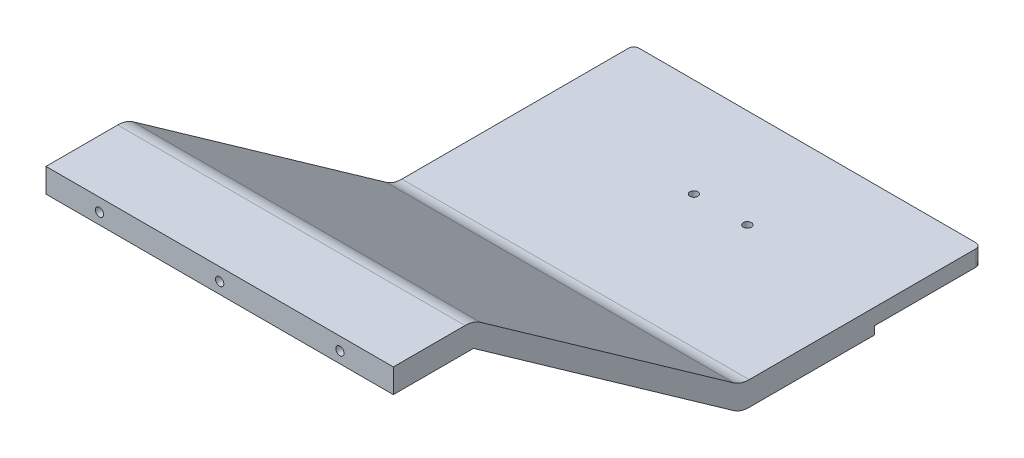
ISO-10303-21;
HEADER;
FILE_DESCRIPTION(('STEP AP214'),'2;1');
FILE_NAME('part.step','',(''),(''),'','','');
FILE_SCHEMA(('AUTOMOTIVE_DESIGN { 1 0 10303 214 1 1 1 1 }'));
ENDSEC;
DATA;
#1=APPLICATION_CONTEXT('core data for automotive mechanical design processes');
#2=APPLICATION_PROTOCOL_DEFINITION('international standard','automotive_design',2000,#1);
#3=PRODUCT_CONTEXT('',#1,'mechanical');
#4=PRODUCT('Part','Part','',(#3));
#5=PRODUCT_RELATED_PRODUCT_CATEGORY('part','',(#4));
#6=PRODUCT_DEFINITION_FORMATION('','',#4);
#7=PRODUCT_DEFINITION_CONTEXT('part definition',#1,'design');
#8=PRODUCT_DEFINITION('design','',#6,#7);
#9=PRODUCT_DEFINITION_SHAPE('','',#8);
#10=(LENGTH_UNIT() NAMED_UNIT(*) SI_UNIT(.MILLI.,.METRE.));
#11=(NAMED_UNIT(*) PLANE_ANGLE_UNIT() SI_UNIT($,.RADIAN.));
#12=(NAMED_UNIT(*) SI_UNIT($,.STERADIAN.) SOLID_ANGLE_UNIT());
#13=UNCERTAINTY_MEASURE_WITH_UNIT(LENGTH_MEASURE(1.E-05),#10,'distance_accuracy_value','');
#14=(GEOMETRIC_REPRESENTATION_CONTEXT(3) GLOBAL_UNCERTAINTY_ASSIGNED_CONTEXT((#13)) GLOBAL_UNIT_ASSIGNED_CONTEXT((#10,
#11,#12)) REPRESENTATION_CONTEXT('',''));
#15=CARTESIAN_POINT('',(0.,0.,0.));
#16=DIRECTION('',(0.,0.,1.));
#17=DIRECTION('',(1.,0.,0.));
#18=AXIS2_PLACEMENT_3D('',#15,#16,#17);
#19=CARTESIAN_POINT('',(209.,70.,-50.));
#20=DIRECTION('',(0.,0.,1.));
#21=DIRECTION('',(1.,0.,0.));
#22=AXIS2_PLACEMENT_3D('',#19,#20,#21);
#23=PLANE('',#22);
#24=DIRECTION('',(0.,1.,0.));
#25=VECTOR('',#24,1.);
#26=CARTESIAN_POINT('',(79.,70.,-50.));
#27=LINE('',#26,#25);
#28=CARTESIAN_POINT('',(79.,70.,-50.));
#29=VERTEX_POINT('',#28);
#30=CARTESIAN_POINT('',(79.,73.,-50.));
#31=VERTEX_POINT('',#30);
#32=EDGE_CURVE('E190',#29,#31,#27,.T.);
#33=ORIENTED_EDGE('',*,*,#32,.T.);
#34=DIRECTION('',(-1.,0.,0.));
#35=VECTOR('',#34,1.);
#36=CARTESIAN_POINT('',(209.,73.,-50.));
#37=LINE('',#36,#35);
#38=CARTESIAN_POINT('',(209.,73.,-50.));
#39=VERTEX_POINT('',#38);
#40=EDGE_CURVE('E252',#39,#31,#37,.T.);
#41=ORIENTED_EDGE('',*,*,#40,.F.);
#42=DIRECTION('',(0.,1.,0.));
#43=VECTOR('',#42,1.);
#44=CARTESIAN_POINT('',(209.,70.,-50.));
#45=LINE('',#44,#43);
#46=CARTESIAN_POINT('',(209.,70.,-50.));
#47=VERTEX_POINT('',#46);
#48=EDGE_CURVE('E197',#47,#39,#45,.T.);
#49=ORIENTED_EDGE('',*,*,#48,.F.);
#50=DIRECTION('',(-1.,0.,0.));
#51=VECTOR('',#50,1.);
#52=CARTESIAN_POINT('',(209.,70.,-50.));
#53=LINE('',#52,#51);
#54=EDGE_CURVE('E214',#47,#29,#53,.T.);
#55=ORIENTED_EDGE('',*,*,#54,.T.);
#56=EDGE_LOOP('',(#33,#41,#49,#55));
#57=FACE_BOUND('',#56,.T.);
#58=ADVANCED_FACE('F57',(#57),#23,.F.);
#59=CARTESIAN_POINT('',(209.,73.,-50.));
#60=DIRECTION('',(0.,1.,0.));
#61=DIRECTION('',(0.,0.,1.));
#62=AXIS2_PLACEMENT_3D('',#59,#60,#61);
#63=PLANE('',#62);
#64=CARTESIAN_POINT('',(138.5,73.,-53.));
#65=DIRECTION('',(0.,-1.,0.));
#66=DIRECTION('',(0.,0.,-1.));
#67=AXIS2_PLACEMENT_3D('',#64,#65,#66);
#68=CIRCLE('',#67,1.5);
#69=CARTESIAN_POINT('',(138.5,73.,-54.5));
#70=VERTEX_POINT('',#69);
#71=EDGE_CURVE('E277',#70,#70,#68,.T.);
#72=ORIENTED_EDGE('',*,*,#71,.F.);
#73=EDGE_LOOP('',(#72));
#74=FACE_BOUND('',#73,.T.);
#75=CARTESIAN_POINT('',(158.5,73.,-53.));
#76=DIRECTION('',(0.,-1.,0.));
#77=DIRECTION('',(0.,0.,-1.));
#78=AXIS2_PLACEMENT_3D('',#75,#76,#77);
#79=CIRCLE('',#78,1.5);
#80=CARTESIAN_POINT('',(158.5,73.,-54.5));
#81=VERTEX_POINT('',#80);
#82=EDGE_CURVE('E557',#81,#81,#79,.T.);
#83=ORIENTED_EDGE('',*,*,#82,.F.);
#84=EDGE_LOOP('',(#83));
#85=FACE_BOUND('',#84,.T.);
#86=DIRECTION('',(-1.,0.,0.));
#87=VECTOR('',#86,1.);
#88=CARTESIAN_POINT('',(209.,73.,-90.));
#89=LINE('',#88,#87);
#90=CARTESIAN_POINT('',(207.,73.,-90.));
#91=VERTEX_POINT('',#90);
#92=CARTESIAN_POINT('',(81.,73.,-90.));
#93=VERTEX_POINT('',#92);
#94=EDGE_CURVE('E247',#91,#93,#89,.T.);
#95=ORIENTED_EDGE('',*,*,#94,.F.);
#96=CARTESIAN_POINT('',(207.,73.,-88.));
#97=DIRECTION('',(0.,1.,0.));
#98=DIRECTION('',(0.,0.,1.));
#99=AXIS2_PLACEMENT_3D('',#96,#97,#98);
#100=CIRCLE('',#99,2.);
#101=CARTESIAN_POINT('',(209.,73.,-88.));
#102=VERTEX_POINT('',#101);
#103=EDGE_CURVE('E267',#91,#102,#100,.F.);
#104=ORIENTED_EDGE('',*,*,#103,.T.);
#105=DIRECTION('',(0.,0.,-1.));
#106=VECTOR('',#105,1.);
#107=CARTESIAN_POINT('',(209.,73.,-50.));
#108=LINE('',#107,#106);
#109=EDGE_CURVE('E196',#39,#102,#108,.T.);
#110=ORIENTED_EDGE('',*,*,#109,.F.);
#111=ORIENTED_EDGE('',*,*,#40,.T.);
#112=DIRECTION('',(0.,0.,-1.));
#113=VECTOR('',#112,1.);
#114=CARTESIAN_POINT('',(79.,73.,-50.));
#115=LINE('',#114,#113);
#116=CARTESIAN_POINT('',(79.,73.,-88.));
#117=VERTEX_POINT('',#116);
#118=EDGE_CURVE('E188',#31,#117,#115,.T.);
#119=ORIENTED_EDGE('',*,*,#118,.T.);
#120=CARTESIAN_POINT('',(81.,73.,-88.));
#121=DIRECTION('',(0.,1.,0.));
#122=DIRECTION('',(0.,0.,1.));
#123=AXIS2_PLACEMENT_3D('',#120,#121,#122);
#124=CIRCLE('',#123,2.);
#125=EDGE_CURVE('E268',#117,#93,#124,.F.);
#126=ORIENTED_EDGE('',*,*,#125,.T.);
#127=EDGE_LOOP('',(#95,#104,#110,#111,#119,#126));
#128=FACE_BOUND('',#127,.T.);
#129=ADVANCED_FACE('F323',(#74,#85,#128),#63,.F.);
#130=CARTESIAN_POINT('',(209.,73.,-90.));
#131=DIRECTION('',(0.,0.,1.));
#132=DIRECTION('',(1.,0.,0.));
#133=AXIS2_PLACEMENT_3D('',#130,#131,#132);
#134=PLANE('',#133);
#135=DIRECTION('',(-1.,0.,0.));
#136=VECTOR('',#135,1.);
#137=CARTESIAN_POINT('',(209.,79.,-90.));
#138=LINE('',#137,#136);
#139=CARTESIAN_POINT('',(207.,79.,-90.));
#140=VERTEX_POINT('',#139);
#141=CARTESIAN_POINT('',(81.,79.,-90.));
#142=VERTEX_POINT('',#141);
#143=EDGE_CURVE('E244',#140,#142,#138,.T.);
#144=ORIENTED_EDGE('',*,*,#143,.F.);
#145=DIRECTION('',(0.,1.,0.));
#146=VECTOR('',#145,1.);
#147=CARTESIAN_POINT('',(207.,73.,-90.));
#148=LINE('',#147,#146);
#149=EDGE_CURVE('E261',#140,#91,#148,.F.);
#150=ORIENTED_EDGE('',*,*,#149,.T.);
#151=ORIENTED_EDGE('',*,*,#94,.T.);
#152=DIRECTION('',(0.,1.,0.));
#153=VECTOR('',#152,1.);
#154=CARTESIAN_POINT('',(81.,73.,-90.));
#155=LINE('',#154,#153);
#156=EDGE_CURVE('E262',#93,#142,#155,.T.);
#157=ORIENTED_EDGE('',*,*,#156,.T.);
#158=EDGE_LOOP('',(#144,#150,#151,#157));
#159=FACE_BOUND('',#158,.T.);
#160=ADVANCED_FACE('F357',(#159),#134,.F.);
#161=CARTESIAN_POINT('',(209.,79.,-90.));
#162=DIRECTION('',(0.,-1.,0.));
#163=DIRECTION('',(0.,0.,-1.));
#164=AXIS2_PLACEMENT_3D('',#161,#162,#163);
#165=PLANE('',#164);
#166=CARTESIAN_POINT('',(138.5,79.,-53.));
#167=DIRECTION('',(0.,-1.,0.));
#168=DIRECTION('',(0.,0.,-1.));
#169=AXIS2_PLACEMENT_3D('',#166,#167,#168);
#170=CIRCLE('',#169,1.5);
#171=CARTESIAN_POINT('',(138.5,79.,-54.5));
#172=VERTEX_POINT('',#171);
#173=EDGE_CURVE('E273',#172,#172,#170,.T.);
#174=ORIENTED_EDGE('',*,*,#173,.T.);
#175=EDGE_LOOP('',(#174));
#176=FACE_BOUND('',#175,.T.);
#177=CARTESIAN_POINT('',(158.5,79.,-53.));
#178=DIRECTION('',(0.,-1.,0.));
#179=DIRECTION('',(0.,0.,-1.));
#180=AXIS2_PLACEMENT_3D('',#177,#178,#179);
#181=CIRCLE('',#180,1.5);
#182=CARTESIAN_POINT('',(158.5,79.,-54.5));
#183=VERTEX_POINT('',#182);
#184=EDGE_CURVE('E275',#183,#183,#181,.T.);
#185=ORIENTED_EDGE('',*,*,#184,.T.);
#186=EDGE_LOOP('',(#185));
#187=FACE_BOUND('',#186,.T.);
#188=DIRECTION('',(0.,0.,1.));
#189=VECTOR('',#188,1.);
#190=CARTESIAN_POINT('',(209.,79.,-90.));
#191=LINE('',#190,#189);
#192=CARTESIAN_POINT('',(209.,79.,-88.));
#193=VERTEX_POINT('',#192);
#194=CARTESIAN_POINT('',(209.,79.,-3.17837245195783));
#195=VERTEX_POINT('',#194);
#196=EDGE_CURVE('E202',#193,#195,#191,.T.);
#197=ORIENTED_EDGE('',*,*,#196,.F.);
#198=CARTESIAN_POINT('',(207.,79.,-88.));
#199=DIRECTION('',(0.,-1.,0.));
#200=DIRECTION('',(0.,0.,-1.));
#201=AXIS2_PLACEMENT_3D('',#198,#199,#200);
#202=CIRCLE('',#201,2.);
#203=EDGE_CURVE('E259',#193,#140,#202,.F.);
#204=ORIENTED_EDGE('',*,*,#203,.T.);
#205=ORIENTED_EDGE('',*,*,#143,.T.);
#206=CARTESIAN_POINT('',(81.,79.,-88.));
#207=DIRECTION('',(0.,-1.,0.));
#208=DIRECTION('',(0.,0.,-1.));
#209=AXIS2_PLACEMENT_3D('',#206,#207,#208);
#210=CIRCLE('',#209,2.);
#211=CARTESIAN_POINT('',(79.,79.,-88.));
#212=VERTEX_POINT('',#211);
#213=EDGE_CURVE('E260',#142,#212,#210,.F.);
#214=ORIENTED_EDGE('',*,*,#213,.T.);
#215=DIRECTION('',(0.,0.,1.));
#216=VECTOR('',#215,1.);
#217=CARTESIAN_POINT('',(79.,79.,-90.));
#218=LINE('',#217,#216);
#219=CARTESIAN_POINT('',(79.,79.,-3.17837245195783));
#220=VERTEX_POINT('',#219);
#221=EDGE_CURVE('E219',#212,#220,#218,.T.);
#222=ORIENTED_EDGE('',*,*,#221,.T.);
#223=DIRECTION('',(-1.,0.,0.));
#224=VECTOR('',#223,1.);
#225=CARTESIAN_POINT('',(209.,79.,-3.17837245195783));
#226=LINE('',#225,#224);
#227=EDGE_CURVE('E245',#195,#220,#226,.T.);
#228=ORIENTED_EDGE('',*,*,#227,.F.);
#229=EDGE_LOOP('',(#197,#204,#205,#214,#222,#228));
#230=FACE_BOUND('',#229,.T.);
#231=ADVANCED_FACE('F334',(#176,#187,#230),#165,.F.);
#232=CARTESIAN_POINT('',(209.,89.,-3.17837245195783));
#233=DIRECTION('',(-1.,0.,0.));
#234=DIRECTION('',(0.,0.,1.));
#235=AXIS2_PLACEMENT_3D('',#232,#233,#234);
#236=CYLINDRICAL_SURFACE('',#235,10.);
#237=CARTESIAN_POINT('',(79.,89.,-3.17837245195783));
#238=DIRECTION('',(-1.,0.,0.));
#239=DIRECTION('',(0.,0.,-1.));
#240=AXIS2_PLACEMENT_3D('',#237,#238,#239);
#241=CIRCLE('',#240,10.);
#242=CARTESIAN_POINT('',(79.,80.8350341907227,2.59513023993843));
#243=VERTEX_POINT('',#242);
#244=EDGE_CURVE('E218',#220,#243,#241,.T.);
#245=ORIENTED_EDGE('',*,*,#244,.T.);
#246=DIRECTION('',(-1.,0.,0.));
#247=VECTOR('',#246,1.);
#248=CARTESIAN_POINT('',(209.,80.8350341907227,2.59513023993843));
#249=LINE('',#248,#247);
#250=CARTESIAN_POINT('',(209.,80.8350341907227,2.59513023993843));
#251=VERTEX_POINT('',#250);
#252=EDGE_CURVE('E237',#251,#243,#249,.T.);
#253=ORIENTED_EDGE('',*,*,#252,.F.);
#254=CARTESIAN_POINT('',(209.,89.,-3.17837245195783));
#255=DIRECTION('',(-1.,0.,0.));
#256=DIRECTION('',(0.,0.,-1.));
#257=AXIS2_PLACEMENT_3D('',#254,#255,#256);
#258=CIRCLE('',#257,10.);
#259=EDGE_CURVE('E201',#195,#251,#258,.T.);
#260=ORIENTED_EDGE('',*,*,#259,.F.);
#261=ORIENTED_EDGE('',*,*,#227,.T.);
#262=EDGE_LOOP('',(#245,#253,#260,#261));
#263=FACE_BOUND('',#262,.T.);
#264=ADVANCED_FACE('F339',(#263),#236,.F.);
#265=CARTESIAN_POINT('',(209.,80.8350341907227,2.59513023993843));
#266=DIRECTION('',(0.,-0.816496580927726,0.577350269189625));
#267=DIRECTION('',(0.,-0.577350269189625,-0.816496580927726));
#268=AXIS2_PLACEMENT_3D('',#265,#266,#267);
#269=PLANE('',#268);
#270=DIRECTION('',(0.,0.577350269189625,0.816496580927726));
#271=VECTOR('',#270,1.);
#272=CARTESIAN_POINT('',(79.,80.8350341907227,2.59513023993843));
#273=LINE('',#272,#271);
#274=CARTESIAN_POINT('',(79.,147.875643927932,97.4048697600616));
#275=VERTEX_POINT('',#274);
#276=EDGE_CURVE('E224',#243,#275,#273,.T.);
#277=ORIENTED_EDGE('',*,*,#276,.T.);
#278=DIRECTION('',(-1.,0.,0.));
#279=VECTOR('',#278,1.);
#280=CARTESIAN_POINT('',(209.,147.875643927932,97.4048697600616));
#281=LINE('',#280,#279);
#282=CARTESIAN_POINT('',(209.,147.875643927932,97.4048697600616));
#283=VERTEX_POINT('',#282);
#284=EDGE_CURVE('E64',#275,#283,#281,.F.);
#285=ORIENTED_EDGE('',*,*,#284,.T.);
#286=DIRECTION('',(0.,0.577350269189625,0.816496580927726));
#287=VECTOR('',#286,1.);
#288=CARTESIAN_POINT('',(209.,80.8350341907227,2.59513023993843));
#289=LINE('',#288,#287);
#290=EDGE_CURVE('E210',#251,#283,#289,.T.);
#291=ORIENTED_EDGE('',*,*,#290,.F.);
#292=ORIENTED_EDGE('',*,*,#252,.T.);
#293=EDGE_LOOP('',(#277,#285,#291,#292));
#294=FACE_BOUND('',#293,.T.);
#295=ADVANCED_FACE('F374',(#294),#269,.F.);
#296=CARTESIAN_POINT('',(209.,140.710678118655,100.));
#297=DIRECTION('',(0.,0.816496580927727,-0.577350269189625));
#298=DIRECTION('',(0.,0.577350269189625,0.816496580927727));
#299=AXIS2_PLACEMENT_3D('',#296,#297,#298);
#300=PLANE('',#299);
#301=DIRECTION('',(0.,-0.577350269189625,-0.816496580927727));
#302=VECTOR('',#301,1.);
#303=CARTESIAN_POINT('',(79.,140.710678118655,100.));
#304=LINE('',#303,#302);
#305=CARTESIAN_POINT('',(79.,140.710678118655,100.));
#306=VERTEX_POINT('',#305);
#307=CARTESIAN_POINT('',(79.,71.8350341907228,2.59513023993842));
#308=VERTEX_POINT('',#307);
#309=EDGE_CURVE('E225',#306,#308,#304,.T.);
#310=ORIENTED_EDGE('',*,*,#309,.T.);
#311=DIRECTION('',(-1.,0.,0.));
#312=VECTOR('',#311,1.);
#313=CARTESIAN_POINT('',(209.,71.8350341907228,2.59513023993842));
#314=LINE('',#313,#312);
#315=CARTESIAN_POINT('',(209.,71.8350341907228,2.59513023993842));
#316=VERTEX_POINT('',#315);
#317=EDGE_CURVE('E234',#316,#308,#314,.T.);
#318=ORIENTED_EDGE('',*,*,#317,.F.);
#319=DIRECTION('',(0.,-0.577350269189625,-0.816496580927727));
#320=VECTOR('',#319,1.);
#321=CARTESIAN_POINT('',(209.,140.710678118655,100.));
#322=LINE('',#321,#320);
#323=CARTESIAN_POINT('',(209.,140.710678118655,100.));
#324=VERTEX_POINT('',#323);
#325=EDGE_CURVE('E209',#324,#316,#322,.T.);
#326=ORIENTED_EDGE('',*,*,#325,.F.);
#327=DIRECTION('',(-1.,0.,0.));
#328=VECTOR('',#327,1.);
#329=CARTESIAN_POINT('',(209.,140.710678118655,100.));
#330=LINE('',#329,#328);
#331=EDGE_CURVE('E240',#324,#306,#330,.T.);
#332=ORIENTED_EDGE('',*,*,#331,.T.);
#333=EDGE_LOOP('',(#310,#318,#326,#332));
#334=FACE_BOUND('',#333,.T.);
#335=ADVANCED_FACE('F304',(#334),#300,.F.);
#336=CARTESIAN_POINT('',(209.,80.,-3.17837245195782));
#337=DIRECTION('',(-1.,0.,0.));
#338=DIRECTION('',(0.,0.,1.));
#339=AXIS2_PLACEMENT_3D('',#336,#337,#338);
#340=CYLINDRICAL_SURFACE('',#339,9.99999999999999);
#341=CARTESIAN_POINT('',(79.,80.,-3.17837245195782));
#342=DIRECTION('',(1.,0.,0.));
#343=DIRECTION('',(0.,0.,-1.));
#344=AXIS2_PLACEMENT_3D('',#341,#342,#343);
#345=CIRCLE('',#344,9.99999999999999);
#346=CARTESIAN_POINT('',(79.,70.,-3.17837245195782));
#347=VERTEX_POINT('',#346);
#348=EDGE_CURVE('E228',#308,#347,#345,.T.);
#349=ORIENTED_EDGE('',*,*,#348,.T.);
#350=DIRECTION('',(-1.,0.,0.));
#351=VECTOR('',#350,1.);
#352=CARTESIAN_POINT('',(209.,70.,-3.17837245195782));
#353=LINE('',#352,#351);
#354=CARTESIAN_POINT('',(209.,70.,-3.17837245195782));
#355=VERTEX_POINT('',#354);
#356=EDGE_CURVE('E233',#355,#347,#353,.T.);
#357=ORIENTED_EDGE('',*,*,#356,.F.);
#358=CARTESIAN_POINT('',(209.,80.,-3.17837245195782));
#359=DIRECTION('',(1.,0.,0.));
#360=DIRECTION('',(0.,0.,-1.));
#361=AXIS2_PLACEMENT_3D('',#358,#359,#360);
#362=CIRCLE('',#361,9.99999999999999);
#363=EDGE_CURVE('E212',#316,#355,#362,.T.);
#364=ORIENTED_EDGE('',*,*,#363,.F.);
#365=ORIENTED_EDGE('',*,*,#317,.T.);
#366=EDGE_LOOP('',(#349,#357,#364,#365));
#367=FACE_BOUND('',#366,.T.);
#368=ADVANCED_FACE('F311',(#367),#340,.T.);
#369=CARTESIAN_POINT('',(209.,70.,-3.17837245195782));
#370=DIRECTION('',(0.,1.,0.));
#371=DIRECTION('',(0.,0.,1.));
#372=AXIS2_PLACEMENT_3D('',#369,#370,#371);
#373=PLANE('',#372);
#374=DIRECTION('',(0.,0.,-1.));
#375=VECTOR('',#374,1.);
#376=CARTESIAN_POINT('',(79.,70.,-3.17837245195782));
#377=LINE('',#376,#375);
#378=EDGE_CURVE('E198',#347,#29,#377,.T.);
#379=ORIENTED_EDGE('',*,*,#378,.T.);
#380=ORIENTED_EDGE('',*,*,#54,.F.);
#381=DIRECTION('',(0.,0.,-1.));
#382=VECTOR('',#381,1.);
#383=CARTESIAN_POINT('',(209.,70.,-3.17837245195782));
#384=LINE('',#383,#382);
#385=EDGE_CURVE('E213',#355,#47,#384,.T.);
#386=ORIENTED_EDGE('',*,*,#385,.F.);
#387=ORIENTED_EDGE('',*,*,#356,.T.);
#388=EDGE_LOOP('',(#379,#380,#386,#387));
#389=FACE_BOUND('',#388,.T.);
#390=ADVANCED_FACE('F314',(#389),#373,.F.);
#391=CARTESIAN_POINT('',(209.,89.,-3.17837245195783));
#392=DIRECTION('',(1.,0.,0.));
#393=DIRECTION('',(0.,0.,-1.));
#394=AXIS2_PLACEMENT_3D('',#391,#392,#393);
#395=PLANE('',#394);
#396=ORIENTED_EDGE('',*,*,#290,.T.);
#397=CARTESIAN_POINT('',(209.,139.710678118655,103.178372451958));
#398=DIRECTION('',(1.,0.,0.));
#399=DIRECTION('',(0.,0.,-1.));
#400=AXIS2_PLACEMENT_3D('',#397,#398,#399);
#401=CIRCLE('',#400,10.);
#402=CARTESIAN_POINT('',(209.,149.710678118655,103.178372451958));
#403=VERTEX_POINT('',#402);
#404=EDGE_CURVE('E12',#283,#403,#401,.T.);
#405=ORIENTED_EDGE('',*,*,#404,.T.);
#406=DIRECTION('',(0.,0.,-1.));
#407=VECTOR('',#406,1.);
#408=CARTESIAN_POINT('',(209.,149.710678118655,130.));
#409=LINE('',#408,#407);
#410=CARTESIAN_POINT('',(209.,149.710678118655,130.));
#411=VERTEX_POINT('',#410);
#412=EDGE_CURVE('E294',#411,#403,#409,.T.);
#413=ORIENTED_EDGE('',*,*,#412,.F.);
#414=DIRECTION('',(0.,1.,0.));
#415=VECTOR('',#414,1.);
#416=CARTESIAN_POINT('',(209.,140.710678118655,130.));
#417=LINE('',#416,#415);
#418=CARTESIAN_POINT('',(209.,140.710678118655,130.));
#419=VERTEX_POINT('',#418);
#420=EDGE_CURVE('E180',#419,#411,#417,.T.);
#421=ORIENTED_EDGE('',*,*,#420,.F.);
#422=DIRECTION('',(0.,0.,-1.));
#423=VECTOR('',#422,1.);
#424=CARTESIAN_POINT('',(209.,140.710678118655,130.));
#425=LINE('',#424,#423);
#426=EDGE_CURVE('E195',#419,#324,#425,.T.);
#427=ORIENTED_EDGE('',*,*,#426,.T.);
#428=ORIENTED_EDGE('',*,*,#325,.T.);
#429=ORIENTED_EDGE('',*,*,#363,.T.);
#430=ORIENTED_EDGE('',*,*,#385,.T.);
#431=ORIENTED_EDGE('',*,*,#48,.T.);
#432=ORIENTED_EDGE('',*,*,#109,.T.);
#433=DIRECTION('',(0.,1.,0.));
#434=VECTOR('',#433,1.);
#435=CARTESIAN_POINT('',(209.,79.,-88.));
#436=LINE('',#435,#434);
#437=EDGE_CURVE('E251',#102,#193,#436,.T.);
#438=ORIENTED_EDGE('',*,*,#437,.T.);
#439=ORIENTED_EDGE('',*,*,#196,.T.);
#440=ORIENTED_EDGE('',*,*,#259,.T.);
#441=EDGE_LOOP('',(#396,#405,#413,#421,#427,#428,#429,#430,#431,#432,#438,#439,#440));
#442=FACE_BOUND('',#441,.T.);
#443=ADVANCED_FACE('F299',(#442),#395,.T.);
#444=CARTESIAN_POINT('',(79.,89.,-3.17837245195783));
#445=DIRECTION('',(1.,0.,0.));
#446=DIRECTION('',(0.,0.,-1.));
#447=AXIS2_PLACEMENT_3D('',#444,#445,#446);
#448=PLANE('',#447);
#449=DIRECTION('',(0.,0.,-1.));
#450=VECTOR('',#449,1.);
#451=CARTESIAN_POINT('',(79.,149.710678118655,130.));
#452=LINE('',#451,#450);
#453=CARTESIAN_POINT('',(79.,149.710678118655,130.));
#454=VERTEX_POINT('',#453);
#455=CARTESIAN_POINT('',(79.,149.710678118655,103.178372451958));
#456=VERTEX_POINT('',#455);
#457=EDGE_CURVE('E164',#454,#456,#452,.T.);
#458=ORIENTED_EDGE('',*,*,#457,.T.);
#459=CARTESIAN_POINT('',(79.,139.710678118655,103.178372451958));
#460=DIRECTION('',(1.,0.,0.));
#461=DIRECTION('',(0.,0.,-1.));
#462=AXIS2_PLACEMENT_3D('',#459,#460,#461);
#463=CIRCLE('',#462,10.);
#464=EDGE_CURVE('E76',#456,#275,#463,.F.);
#465=ORIENTED_EDGE('',*,*,#464,.T.);
#466=ORIENTED_EDGE('',*,*,#276,.F.);
#467=ORIENTED_EDGE('',*,*,#244,.F.);
#468=ORIENTED_EDGE('',*,*,#221,.F.);
#469=DIRECTION('',(0.,1.,0.));
#470=VECTOR('',#469,1.);
#471=CARTESIAN_POINT('',(79.,89.,-88.));
#472=LINE('',#471,#470);
#473=EDGE_CURVE('E266',#212,#117,#472,.F.);
#474=ORIENTED_EDGE('',*,*,#473,.T.);
#475=ORIENTED_EDGE('',*,*,#118,.F.);
#476=ORIENTED_EDGE('',*,*,#32,.F.);
#477=ORIENTED_EDGE('',*,*,#378,.F.);
#478=ORIENTED_EDGE('',*,*,#348,.F.);
#479=ORIENTED_EDGE('',*,*,#309,.F.);
#480=DIRECTION('',(0.,0.,-1.));
#481=VECTOR('',#480,1.);
#482=CARTESIAN_POINT('',(79.,140.710678118655,130.));
#483=LINE('',#482,#481);
#484=CARTESIAN_POINT('',(79.,140.710678118655,130.));
#485=VERTEX_POINT('',#484);
#486=EDGE_CURVE('E166',#485,#306,#483,.T.);
#487=ORIENTED_EDGE('',*,*,#486,.F.);
#488=DIRECTION('',(0.,-1.,0.));
#489=VECTOR('',#488,1.);
#490=CARTESIAN_POINT('',(79.,149.710678118655,130.));
#491=LINE('',#490,#489);
#492=EDGE_CURVE('E163',#454,#485,#491,.T.);
#493=ORIENTED_EDGE('',*,*,#492,.F.);
#494=EDGE_LOOP('',(#458,#465,#466,#467,#468,#474,#475,#476,#477,#478,#479,#487,#493));
#495=FACE_BOUND('',#494,.T.);
#496=ADVANCED_FACE('F161',(#495),#448,.F.);
#497=CARTESIAN_POINT('',(209.,149.710678118655,130.));
#498=DIRECTION('',(0.,-1.,0.));
#499=DIRECTION('',(0.,0.,-1.));
#500=AXIS2_PLACEMENT_3D('',#497,#498,#499);
#501=PLANE('',#500);
#502=ORIENTED_EDGE('',*,*,#412,.T.);
#503=DIRECTION('',(-1.,0.,0.));
#504=VECTOR('',#503,1.);
#505=CARTESIAN_POINT('',(209.,149.710678118655,103.178372451958));
#506=LINE('',#505,#504);
#507=EDGE_CURVE('E187',#403,#456,#506,.T.);
#508=ORIENTED_EDGE('',*,*,#507,.T.);
#509=ORIENTED_EDGE('',*,*,#457,.F.);
#510=DIRECTION('',(-1.,0.,0.));
#511=VECTOR('',#510,1.);
#512=CARTESIAN_POINT('',(209.,149.710678118655,130.));
#513=LINE('',#512,#511);
#514=EDGE_CURVE('E175',#411,#454,#513,.T.);
#515=ORIENTED_EDGE('',*,*,#514,.F.);
#516=EDGE_LOOP('',(#502,#508,#509,#515));
#517=FACE_BOUND('',#516,.T.);
#518=ADVANCED_FACE('F183',(#517),#501,.F.);
#519=CARTESIAN_POINT('',(79.,140.710678118655,130.));
#520=DIRECTION('',(0.,1.,0.));
#521=DIRECTION('',(0.,0.,1.));
#522=AXIS2_PLACEMENT_3D('',#519,#520,#521);
#523=PLANE('',#522);
#524=ORIENTED_EDGE('',*,*,#331,.F.);
#525=ORIENTED_EDGE('',*,*,#426,.F.);
#526=DIRECTION('',(1.,0.,0.));
#527=VECTOR('',#526,1.);
#528=CARTESIAN_POINT('',(79.,140.710678118655,130.));
#529=LINE('',#528,#527);
#530=EDGE_CURVE('E171',#485,#419,#529,.T.);
#531=ORIENTED_EDGE('',*,*,#530,.F.);
#532=ORIENTED_EDGE('',*,*,#486,.T.);
#533=EDGE_LOOP('',(#524,#525,#531,#532));
#534=FACE_BOUND('',#533,.T.);
#535=ADVANCED_FACE('F303',(#534),#523,.F.);
#536=CARTESIAN_POINT('',(0.,0.,130.));
#537=DIRECTION('',(0.,0.,1.));
#538=DIRECTION('',(1.,0.,0.));
#539=AXIS2_PLACEMENT_3D('',#536,#537,#538);
#540=PLANE('',#539);
#541=CARTESIAN_POINT('',(99.,144.890678118655,130.));
#542=DIRECTION('',(0.,0.,1.));
#543=DIRECTION('',(1.,0.,0.));
#544=AXIS2_PLACEMENT_3D('',#541,#542,#543);
#545=CIRCLE('',#544,1.54999999999999);
#546=CARTESIAN_POINT('',(100.55,144.890678118655,130.));
#547=VERTEX_POINT('',#546);
#548=EDGE_CURVE('E555',#547,#547,#545,.T.);
#549=ORIENTED_EDGE('',*,*,#548,.F.);
#550=EDGE_LOOP('',(#549));
#551=FACE_BOUND('',#550,.T.);
#552=CARTESIAN_POINT('',(144.,144.890678118655,130.));
#553=DIRECTION('',(0.,0.,1.));
#554=DIRECTION('',(1.,0.,0.));
#555=AXIS2_PLACEMENT_3D('',#552,#553,#554);
#556=CIRCLE('',#555,1.54999999999999);
#557=CARTESIAN_POINT('',(145.55,144.890678118655,130.));
#558=VERTEX_POINT('',#557);
#559=EDGE_CURVE('E560',#558,#558,#556,.T.);
#560=ORIENTED_EDGE('',*,*,#559,.F.);
#561=EDGE_LOOP('',(#560));
#562=FACE_BOUND('',#561,.T.);
#563=CARTESIAN_POINT('',(189.,144.890678118655,130.));
#564=DIRECTION('',(0.,0.,1.));
#565=DIRECTION('',(1.,0.,0.));
#566=AXIS2_PLACEMENT_3D('',#563,#564,#565);
#567=CIRCLE('',#566,1.54999999999999);
#568=CARTESIAN_POINT('',(190.55,144.890678118655,130.));
#569=VERTEX_POINT('',#568);
#570=EDGE_CURVE('E281',#569,#569,#567,.T.);
#571=ORIENTED_EDGE('',*,*,#570,.F.);
#572=EDGE_LOOP('',(#571));
#573=FACE_BOUND('',#572,.T.);
#574=ORIENTED_EDGE('',*,*,#514,.T.);
#575=ORIENTED_EDGE('',*,*,#492,.T.);
#576=ORIENTED_EDGE('',*,*,#530,.T.);
#577=ORIENTED_EDGE('',*,*,#420,.T.);
#578=EDGE_LOOP('',(#574,#575,#576,#577));
#579=FACE_BOUND('',#578,.T.);
#580=ADVANCED_FACE('F174',(#551,#562,#573,#579),#540,.T.);
#581=CARTESIAN_POINT('',(189.,144.890678118655,125.));
#582=DIRECTION('',(0.,0.,1.));
#583=DIRECTION('',(1.,0.,0.));
#584=AXIS2_PLACEMENT_3D('',#581,#582,#583);
#585=CYLINDRICAL_SURFACE('',#584,1.54999999999999);
#586=CARTESIAN_POINT('',(189.,144.890678118655,125.));
#587=DIRECTION('',(0.,0.,1.));
#588=DIRECTION('',(1.,0.,0.));
#589=AXIS2_PLACEMENT_3D('',#586,#587,#588);
#590=CIRCLE('',#589,1.54999999999999);
#591=CARTESIAN_POINT('',(190.55,144.890678118655,125.));
#592=VERTEX_POINT('',#591);
#593=EDGE_CURVE('E279',#592,#592,#590,.T.);
#594=ORIENTED_EDGE('',*,*,#593,.F.);
#595=EDGE_LOOP('',(#594));
#596=FACE_BOUND('',#595,.T.);
#597=ORIENTED_EDGE('',*,*,#570,.T.);
#598=EDGE_LOOP('',(#597));
#599=FACE_BOUND('',#598,.T.);
#600=ADVANCED_FACE('F502',(#596,#599),#585,.F.);
#601=CARTESIAN_POINT('',(189.,144.890678118655,125.));
#602=DIRECTION('',(0.,0.,1.));
#603=DIRECTION('',(1.,0.,0.));
#604=AXIS2_PLACEMENT_3D('',#601,#602,#603);
#605=PLANE('',#604);
#606=ORIENTED_EDGE('',*,*,#593,.T.);
#607=EDGE_LOOP('',(#606));
#608=FACE_BOUND('',#607,.T.);
#609=ADVANCED_FACE('F514',(#608),#605,.T.);
#610=CARTESIAN_POINT('',(144.,144.890678118655,125.));
#611=DIRECTION('',(0.,0.,1.));
#612=DIRECTION('',(1.,0.,0.));
#613=AXIS2_PLACEMENT_3D('',#610,#611,#612);
#614=CYLINDRICAL_SURFACE('',#613,1.54999999999999);
#615=CARTESIAN_POINT('',(144.,144.890678118655,125.));
#616=DIRECTION('',(0.,0.,1.));
#617=DIRECTION('',(1.,0.,0.));
#618=AXIS2_PLACEMENT_3D('',#615,#616,#617);
#619=CIRCLE('',#618,1.54999999999999);
#620=CARTESIAN_POINT('',(145.55,144.890678118655,125.));
#621=VERTEX_POINT('',#620);
#622=EDGE_CURVE('E290',#621,#621,#619,.T.);
#623=ORIENTED_EDGE('',*,*,#622,.F.);
#624=EDGE_LOOP('',(#623));
#625=FACE_BOUND('',#624,.T.);
#626=ORIENTED_EDGE('',*,*,#559,.T.);
#627=EDGE_LOOP('',(#626));
#628=FACE_BOUND('',#627,.T.);
#629=ADVANCED_FACE('F525',(#625,#628),#614,.F.);
#630=CARTESIAN_POINT('',(144.,144.890678118655,125.));
#631=DIRECTION('',(0.,0.,1.));
#632=DIRECTION('',(1.,0.,0.));
#633=AXIS2_PLACEMENT_3D('',#630,#631,#632);
#634=PLANE('',#633);
#635=ORIENTED_EDGE('',*,*,#622,.T.);
#636=EDGE_LOOP('',(#635));
#637=FACE_BOUND('',#636,.T.);
#638=ADVANCED_FACE('F526',(#637),#634,.T.);
#639=CARTESIAN_POINT('',(99.,144.890678118655,125.));
#640=DIRECTION('',(0.,0.,1.));
#641=DIRECTION('',(1.,0.,0.));
#642=AXIS2_PLACEMENT_3D('',#639,#640,#641);
#643=CYLINDRICAL_SURFACE('',#642,1.54999999999999);
#644=CARTESIAN_POINT('',(99.,144.890678118655,125.));
#645=DIRECTION('',(0.,0.,1.));
#646=DIRECTION('',(1.,0.,0.));
#647=AXIS2_PLACEMENT_3D('',#644,#645,#646);
#648=CIRCLE('',#647,1.54999999999999);
#649=CARTESIAN_POINT('',(100.55,144.890678118655,125.));
#650=VERTEX_POINT('',#649);
#651=EDGE_CURVE('E181',#650,#650,#648,.T.);
#652=ORIENTED_EDGE('',*,*,#651,.F.);
#653=EDGE_LOOP('',(#652));
#654=FACE_BOUND('',#653,.T.);
#655=ORIENTED_EDGE('',*,*,#548,.T.);
#656=EDGE_LOOP('',(#655));
#657=FACE_BOUND('',#656,.T.);
#658=ADVANCED_FACE('F539',(#654,#657),#643,.F.);
#659=CARTESIAN_POINT('',(99.,144.890678118655,125.));
#660=DIRECTION('',(0.,0.,1.));
#661=DIRECTION('',(1.,0.,0.));
#662=AXIS2_PLACEMENT_3D('',#659,#660,#661);
#663=PLANE('',#662);
#664=ORIENTED_EDGE('',*,*,#651,.T.);
#665=EDGE_LOOP('',(#664));
#666=FACE_BOUND('',#665,.T.);
#667=ADVANCED_FACE('F364',(#666),#663,.T.);
#668=CARTESIAN_POINT('',(207.,89.,-88.));
#669=DIRECTION('',(0.,-1.,0.));
#670=DIRECTION('',(0.,0.,-1.));
#671=AXIS2_PLACEMENT_3D('',#668,#669,#670);
#672=CYLINDRICAL_SURFACE('',#671,2.);
#673=ORIENTED_EDGE('',*,*,#103,.F.);
#674=ORIENTED_EDGE('',*,*,#149,.F.);
#675=ORIENTED_EDGE('',*,*,#203,.F.);
#676=ORIENTED_EDGE('',*,*,#437,.F.);
#677=EDGE_LOOP('',(#673,#674,#675,#676));
#678=FACE_BOUND('',#677,.T.);
#679=ADVANCED_FACE('F329',(#678),#672,.T.);
#680=CARTESIAN_POINT('',(81.,73.,-88.));
#681=DIRECTION('',(0.,1.,0.));
#682=DIRECTION('',(0.,0.,1.));
#683=AXIS2_PLACEMENT_3D('',#680,#681,#682);
#684=CYLINDRICAL_SURFACE('',#683,2.);
#685=ORIENTED_EDGE('',*,*,#125,.F.);
#686=ORIENTED_EDGE('',*,*,#473,.F.);
#687=ORIENTED_EDGE('',*,*,#213,.F.);
#688=ORIENTED_EDGE('',*,*,#156,.F.);
#689=EDGE_LOOP('',(#685,#686,#687,#688));
#690=FACE_BOUND('',#689,.T.);
#691=ADVANCED_FACE('F361',(#690),#684,.T.);
#692=CARTESIAN_POINT('',(158.5,149.710678118655,-53.));
#693=DIRECTION('',(0.,-1.,0.));
#694=DIRECTION('',(0.,0.,-1.));
#695=AXIS2_PLACEMENT_3D('',#692,#693,#694);
#696=CYLINDRICAL_SURFACE('',#695,1.5);
#697=CARTESIAN_POINT('',(158.5,73.,-54.5));
#698=CARTESIAN_POINT('',(158.5,73.0625,-54.5));
#699=CARTESIAN_POINT('',(158.5,73.125,-54.5));
#700=CARTESIAN_POINT('',(158.5,73.25,-54.5));
#701=CARTESIAN_POINT('',(158.5,73.3125,-54.5));
#702=CARTESIAN_POINT('',(158.5,73.4375,-54.5));
#703=CARTESIAN_POINT('',(158.5,73.5,-54.5));
#704=CARTESIAN_POINT('',(158.5,73.625,-54.5));
#705=CARTESIAN_POINT('',(158.5,73.6875,-54.5));
#706=CARTESIAN_POINT('',(158.5,73.8125,-54.5));
#707=CARTESIAN_POINT('',(158.5,73.875,-54.5));
#708=CARTESIAN_POINT('',(158.5,74.,-54.5));
#709=CARTESIAN_POINT('',(158.5,74.0625,-54.5));
#710=CARTESIAN_POINT('',(158.5,74.1875,-54.5));
#711=CARTESIAN_POINT('',(158.5,74.25,-54.5));
#712=CARTESIAN_POINT('',(158.5,74.375,-54.5));
#713=CARTESIAN_POINT('',(158.5,74.4375,-54.5));
#714=CARTESIAN_POINT('',(158.5,74.5625,-54.5));
#715=CARTESIAN_POINT('',(158.5,74.625,-54.5));
#716=CARTESIAN_POINT('',(158.5,74.75,-54.5));
#717=CARTESIAN_POINT('',(158.5,74.8125,-54.5));
#718=CARTESIAN_POINT('',(158.5,74.9375,-54.5));
#719=CARTESIAN_POINT('',(158.5,75.,-54.5));
#720=CARTESIAN_POINT('',(158.5,75.125,-54.5));
#721=CARTESIAN_POINT('',(158.5,75.1875,-54.5));
#722=CARTESIAN_POINT('',(158.5,75.3125,-54.5));
#723=CARTESIAN_POINT('',(158.5,75.375,-54.5));
#724=CARTESIAN_POINT('',(158.5,75.5,-54.5));
#725=CARTESIAN_POINT('',(158.5,75.5625,-54.5));
#726=CARTESIAN_POINT('',(158.5,75.6875,-54.5));
#727=CARTESIAN_POINT('',(158.5,75.75,-54.5));
#728=CARTESIAN_POINT('',(158.5,75.875,-54.5));
#729=CARTESIAN_POINT('',(158.5,75.9375,-54.5));
#730=CARTESIAN_POINT('',(158.5,76.0625,-54.5));
#731=CARTESIAN_POINT('',(158.5,76.125,-54.5));
#732=CARTESIAN_POINT('',(158.5,76.25,-54.5));
#733=CARTESIAN_POINT('',(158.5,76.3125,-54.5));
#734=CARTESIAN_POINT('',(158.5,76.4375,-54.5));
#735=CARTESIAN_POINT('',(158.5,76.5,-54.5));
#736=CARTESIAN_POINT('',(158.5,76.625,-54.5));
#737=CARTESIAN_POINT('',(158.5,76.6875,-54.5));
#738=CARTESIAN_POINT('',(158.5,76.8125,-54.5));
#739=CARTESIAN_POINT('',(158.5,76.875,-54.5));
#740=CARTESIAN_POINT('',(158.5,77.,-54.5));
#741=CARTESIAN_POINT('',(158.5,77.0625,-54.5));
#742=CARTESIAN_POINT('',(158.5,77.1875,-54.5));
#743=CARTESIAN_POINT('',(158.5,77.25,-54.5));
#744=CARTESIAN_POINT('',(158.5,77.375,-54.5));
#745=CARTESIAN_POINT('',(158.5,77.4375,-54.5));
#746=CARTESIAN_POINT('',(158.5,77.5625,-54.5));
#747=CARTESIAN_POINT('',(158.5,77.625,-54.5));
#748=CARTESIAN_POINT('',(158.5,77.75,-54.5));
#749=CARTESIAN_POINT('',(158.5,77.8125,-54.5));
#750=CARTESIAN_POINT('',(158.5,77.9375,-54.5));
#751=CARTESIAN_POINT('',(158.5,78.,-54.5));
#752=CARTESIAN_POINT('',(158.5,78.125,-54.5));
#753=CARTESIAN_POINT('',(158.5,78.1875,-54.5));
#754=CARTESIAN_POINT('',(158.5,78.3125,-54.5));
#755=CARTESIAN_POINT('',(158.5,78.375,-54.5));
#756=CARTESIAN_POINT('',(158.5,78.5,-54.5));
#757=CARTESIAN_POINT('',(158.5,78.5625,-54.5));
#758=CARTESIAN_POINT('',(158.5,78.6875,-54.5));
#759=CARTESIAN_POINT('',(158.5,78.75,-54.5));
#760=CARTESIAN_POINT('',(158.5,78.875,-54.5));
#761=CARTESIAN_POINT('',(158.5,78.9375,-54.5));
#762=CARTESIAN_POINT('',(158.5,79.,-54.5));
#763=B_SPLINE_CURVE_WITH_KNOTS('',3,(#697,#698,#699,#700,#701,#702,#703,#704,#705,#706,#707,
#708,#709,#710,#711,#712,#713,#714,#715,#716,#717,#718,#719,#720,#721,#722,#723,#724,#725,#726,
#727,#728,#729,#730,#731,#732,#733,#734,#735,#736,#737,#738,#739,#740,#741,#742,#743,#744,#745,
#746,#747,#748,#749,#750,#751,#752,#753,#754,#755,#756,#757,#758,#759,#760,#761,#762),
.UNSPECIFIED.,.F.,.F.,(4,2,2,2,2,2,2,2,2,2,2,2,2,2,2,2,2,2,2,2,2,2,2,2,2,2,2,2,2,2,2,2,4),(0.,
0.187500000000007,0.375,0.562500000000007,0.750000000000001,0.937500000000008,1.125,
1.31250000000001,1.5,1.68750000000001,1.87500000000002,2.06250000000001,2.25000000000002,
2.43750000000001,2.62500000000002,2.81250000000001,3.00000000000002,3.18750000000002,
3.37500000000002,3.56250000000002,3.75000000000002,3.93750000000002,4.12500000000002,
4.31250000000002,4.50000000000003,4.68750000000002,4.87500000000003,5.06250000000002,
5.25000000000003,5.43750000000003,5.62500000000003,5.81250000000003,6.00000000000003),.UNSPECIFIED.);
#764=EDGE_CURVE('BSEAM349',#81,#183,#763,.T.);
#765=ORIENTED_EDGE('',*,*,#82,.T.);
#766=ORIENTED_EDGE('',*,*,#184,.F.);
#767=ORIENTED_EDGE('',*,*,#764,.T.);
#768=ORIENTED_EDGE('',*,*,#764,.F.);
#769=EDGE_LOOP('',(#765,#767,#766,#768));
#770=FACE_BOUND('',#769,.T.);
#771=ADVANCED_FACE('F349',(#770),#696,.F.);
#772=CARTESIAN_POINT('',(138.5,149.710678118655,-53.));
#773=DIRECTION('',(0.,-1.,0.));
#774=DIRECTION('',(0.,0.,-1.));
#775=AXIS2_PLACEMENT_3D('',#772,#773,#774);
#776=CYLINDRICAL_SURFACE('',#775,1.5);
#777=CARTESIAN_POINT('',(138.5,73.,-54.5));
#778=CARTESIAN_POINT('',(138.5,73.0625,-54.5));
#779=CARTESIAN_POINT('',(138.5,73.125,-54.5));
#780=CARTESIAN_POINT('',(138.5,73.25,-54.5));
#781=CARTESIAN_POINT('',(138.5,73.3125,-54.5));
#782=CARTESIAN_POINT('',(138.5,73.4375,-54.5));
#783=CARTESIAN_POINT('',(138.5,73.5,-54.5));
#784=CARTESIAN_POINT('',(138.5,73.625,-54.5));
#785=CARTESIAN_POINT('',(138.5,73.6875,-54.5));
#786=CARTESIAN_POINT('',(138.5,73.8125,-54.5));
#787=CARTESIAN_POINT('',(138.5,73.875,-54.5));
#788=CARTESIAN_POINT('',(138.5,74.,-54.5));
#789=CARTESIAN_POINT('',(138.5,74.0625,-54.5));
#790=CARTESIAN_POINT('',(138.5,74.1875,-54.5));
#791=CARTESIAN_POINT('',(138.5,74.25,-54.5));
#792=CARTESIAN_POINT('',(138.5,74.375,-54.5));
#793=CARTESIAN_POINT('',(138.5,74.4375,-54.5));
#794=CARTESIAN_POINT('',(138.5,74.5625,-54.5));
#795=CARTESIAN_POINT('',(138.5,74.625,-54.5));
#796=CARTESIAN_POINT('',(138.5,74.75,-54.5));
#797=CARTESIAN_POINT('',(138.5,74.8125,-54.5));
#798=CARTESIAN_POINT('',(138.5,74.9375,-54.5));
#799=CARTESIAN_POINT('',(138.5,75.,-54.5));
#800=CARTESIAN_POINT('',(138.5,75.125,-54.5));
#801=CARTESIAN_POINT('',(138.5,75.1875,-54.5));
#802=CARTESIAN_POINT('',(138.5,75.3125,-54.5));
#803=CARTESIAN_POINT('',(138.5,75.375,-54.5));
#804=CARTESIAN_POINT('',(138.5,75.5,-54.5));
#805=CARTESIAN_POINT('',(138.5,75.5625,-54.5));
#806=CARTESIAN_POINT('',(138.5,75.6875,-54.5));
#807=CARTESIAN_POINT('',(138.5,75.75,-54.5));
#808=CARTESIAN_POINT('',(138.5,75.875,-54.5));
#809=CARTESIAN_POINT('',(138.5,75.9375,-54.5));
#810=CARTESIAN_POINT('',(138.5,76.0625,-54.5));
#811=CARTESIAN_POINT('',(138.5,76.125,-54.5));
#812=CARTESIAN_POINT('',(138.5,76.25,-54.5));
#813=CARTESIAN_POINT('',(138.5,76.3125,-54.5));
#814=CARTESIAN_POINT('',(138.5,76.4375,-54.5));
#815=CARTESIAN_POINT('',(138.5,76.5,-54.5));
#816=CARTESIAN_POINT('',(138.5,76.625,-54.5));
#817=CARTESIAN_POINT('',(138.5,76.6875,-54.5));
#818=CARTESIAN_POINT('',(138.5,76.8125,-54.5));
#819=CARTESIAN_POINT('',(138.5,76.875,-54.5));
#820=CARTESIAN_POINT('',(138.5,77.,-54.5));
#821=CARTESIAN_POINT('',(138.5,77.0625,-54.5));
#822=CARTESIAN_POINT('',(138.5,77.1875,-54.5));
#823=CARTESIAN_POINT('',(138.5,77.25,-54.5));
#824=CARTESIAN_POINT('',(138.5,77.375,-54.5));
#825=CARTESIAN_POINT('',(138.5,77.4375,-54.5));
#826=CARTESIAN_POINT('',(138.5,77.5625,-54.5));
#827=CARTESIAN_POINT('',(138.5,77.625,-54.5));
#828=CARTESIAN_POINT('',(138.5,77.75,-54.5));
#829=CARTESIAN_POINT('',(138.5,77.8125,-54.5));
#830=CARTESIAN_POINT('',(138.5,77.9375,-54.5));
#831=CARTESIAN_POINT('',(138.5,78.,-54.5));
#832=CARTESIAN_POINT('',(138.5,78.125,-54.5));
#833=CARTESIAN_POINT('',(138.5,78.1875,-54.5));
#834=CARTESIAN_POINT('',(138.5,78.3125,-54.5));
#835=CARTESIAN_POINT('',(138.5,78.375,-54.5));
#836=CARTESIAN_POINT('',(138.5,78.5,-54.5));
#837=CARTESIAN_POINT('',(138.5,78.5625,-54.5));
#838=CARTESIAN_POINT('',(138.5,78.6875,-54.5));
#839=CARTESIAN_POINT('',(138.5,78.75,-54.5));
#840=CARTESIAN_POINT('',(138.5,78.875,-54.5));
#841=CARTESIAN_POINT('',(138.5,78.9375,-54.5));
#842=CARTESIAN_POINT('',(138.5,79.,-54.5));
#843=B_SPLINE_CURVE_WITH_KNOTS('',3,(#777,#778,#779,#780,#781,#782,#783,#784,#785,#786,#787,
#788,#789,#790,#791,#792,#793,#794,#795,#796,#797,#798,#799,#800,#801,#802,#803,#804,#805,#806,
#807,#808,#809,#810,#811,#812,#813,#814,#815,#816,#817,#818,#819,#820,#821,#822,#823,#824,#825,
#826,#827,#828,#829,#830,#831,#832,#833,#834,#835,#836,#837,#838,#839,#840,#841,#842),
.UNSPECIFIED.,.F.,.F.,(4,2,2,2,2,2,2,2,2,2,2,2,2,2,2,2,2,2,2,2,2,2,2,2,2,2,2,2,2,2,2,2,4),(0.,
0.187500000000007,0.375,0.562500000000007,0.750000000000001,0.937500000000008,1.125,
1.31250000000001,1.5,1.68750000000001,1.87500000000002,2.06250000000001,2.25000000000002,
2.43750000000001,2.62500000000002,2.81250000000001,3.00000000000002,3.18750000000002,
3.37500000000002,3.56250000000002,3.75000000000002,3.93750000000002,4.12500000000002,
4.31250000000002,4.50000000000003,4.68750000000002,4.87500000000003,5.06250000000002,
5.25000000000003,5.43750000000003,5.62500000000003,5.81250000000003,6.00000000000003),.UNSPECIFIED.);
#844=EDGE_CURVE('BSEAM343',#70,#172,#843,.T.);
#845=ORIENTED_EDGE('',*,*,#71,.T.);
#846=ORIENTED_EDGE('',*,*,#173,.F.);
#847=ORIENTED_EDGE('',*,*,#844,.T.);
#848=ORIENTED_EDGE('',*,*,#844,.F.);
#849=EDGE_LOOP('',(#845,#847,#846,#848));
#850=FACE_BOUND('',#849,.T.);
#851=ADVANCED_FACE('F343',(#850),#776,.F.);
#852=CARTESIAN_POINT('',(209.,139.710678118655,103.178372451958));
#853=DIRECTION('',(-1.,0.,0.));
#854=DIRECTION('',(0.,0.,1.));
#855=AXIS2_PLACEMENT_3D('',#852,#853,#854);
#856=CYLINDRICAL_SURFACE('',#855,10.);
#857=ORIENTED_EDGE('',*,*,#404,.F.);
#858=ORIENTED_EDGE('',*,*,#284,.F.);
#859=ORIENTED_EDGE('',*,*,#464,.F.);
#860=ORIENTED_EDGE('',*,*,#507,.F.);
#861=EDGE_LOOP('',(#857,#858,#859,#860));
#862=FACE_BOUND('',#861,.T.);
#863=ADVANCED_FACE('F59',(#862),#856,.T.);
#864=CLOSED_SHELL('',(#58,#129,#160,#231,#264,#295,#335,#368,#390,#443,#496,#518,#535,#580,#600,
#609,#629,#638,#658,#667,#679,#691,#771,#851,#863));
#865=MANIFOLD_SOLID_BREP('B2',#864);
#866=ADVANCED_BREP_SHAPE_REPRESENTATION('',(#18,#865),#14);
#867=SHAPE_DEFINITION_REPRESENTATION(#9,#866);
ENDSEC;
END-ISO-10303-21;
